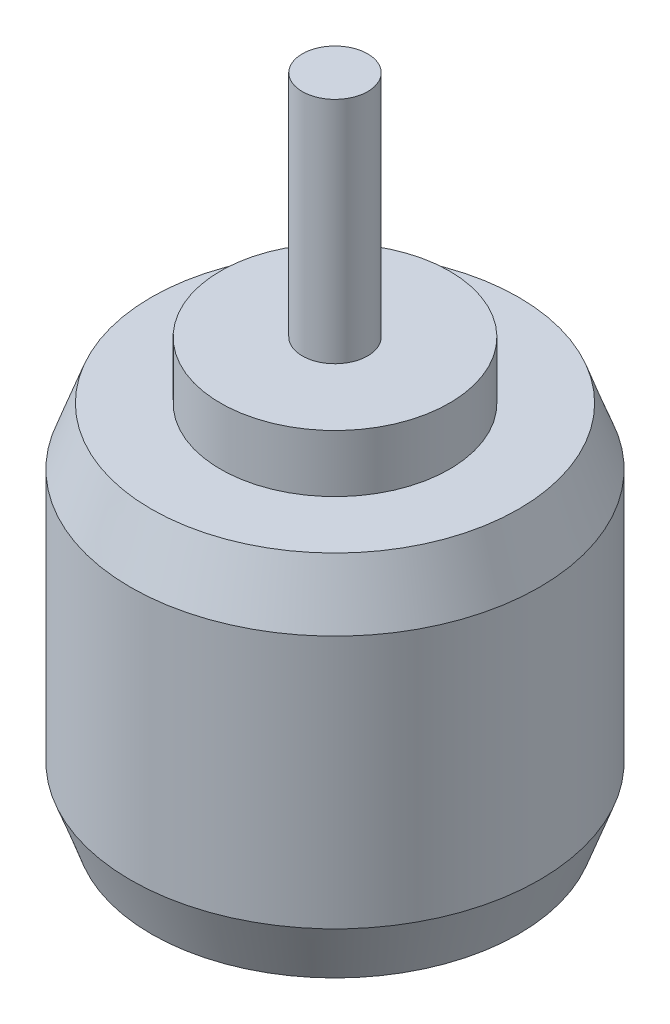
ISO-10303-21;
HEADER;
FILE_DESCRIPTION(('STEP AP214'),'2;1');
FILE_NAME('part.step','',(''),(''),'','','');
FILE_SCHEMA(('AUTOMOTIVE_DESIGN { 1 0 10303 214 1 1 1 1 }'));
ENDSEC;
DATA;
#1=APPLICATION_CONTEXT('core data for automotive mechanical design processes');
#2=APPLICATION_PROTOCOL_DEFINITION('international standard','automotive_design',2000,#1);
#3=PRODUCT_CONTEXT('',#1,'mechanical');
#4=PRODUCT('Part','Part','',(#3));
#5=PRODUCT_RELATED_PRODUCT_CATEGORY('part','',(#4));
#6=PRODUCT_DEFINITION_FORMATION('','',#4);
#7=PRODUCT_DEFINITION_CONTEXT('part definition',#1,'design');
#8=PRODUCT_DEFINITION('design','',#6,#7);
#9=PRODUCT_DEFINITION_SHAPE('','',#8);
#10=(LENGTH_UNIT() NAMED_UNIT(*) SI_UNIT(.MILLI.,.METRE.));
#11=(NAMED_UNIT(*) PLANE_ANGLE_UNIT() SI_UNIT($,.RADIAN.));
#12=(NAMED_UNIT(*) SI_UNIT($,.STERADIAN.) SOLID_ANGLE_UNIT());
#13=UNCERTAINTY_MEASURE_WITH_UNIT(LENGTH_MEASURE(1.E-05),#10,'distance_accuracy_value','');
#14=(GEOMETRIC_REPRESENTATION_CONTEXT(3) GLOBAL_UNCERTAINTY_ASSIGNED_CONTEXT((#13)) GLOBAL_UNIT_ASSIGNED_CONTEXT((#10,
#11,#12)) REPRESENTATION_CONTEXT('',''));
#15=CARTESIAN_POINT('',(0.,0.,0.));
#16=DIRECTION('',(0.,0.,1.));
#17=DIRECTION('',(1.,0.,0.));
#18=AXIS2_PLACEMENT_3D('',#15,#16,#17);
#19=CARTESIAN_POINT('',(0.,52.,0.));
#20=DIRECTION('',(0.,-1.,0.));
#21=DIRECTION('',(0.,0.,-1.));
#22=AXIS2_PLACEMENT_3D('',#19,#20,#21);
#23=PLANE('',#22);
#24=CARTESIAN_POINT('',(0.,52.,0.));
#25=DIRECTION('',(0.,-1.,0.));
#26=DIRECTION('',(0.,0.,-1.));
#27=AXIS2_PLACEMENT_3D('',#24,#25,#26);
#28=CIRCLE('',#27,14.);
#29=CARTESIAN_POINT('',(0.,52.,-14.));
#30=VERTEX_POINT('',#29);
#31=EDGE_CURVE('E83',#30,#30,#28,.T.);
#32=ORIENTED_EDGE('',*,*,#31,.F.);
#33=EDGE_LOOP('',(#32));
#34=FACE_BOUND('',#33,.T.);
#35=CARTESIAN_POINT('',(0.,52.,0.));
#36=DIRECTION('',(0.,-1.,0.));
#37=DIRECTION('',(0.,0.,-1.));
#38=AXIS2_PLACEMENT_3D('',#35,#36,#37);
#39=CIRCLE('',#38,4.);
#40=CARTESIAN_POINT('',(0.,52.,-4.));
#41=VERTEX_POINT('',#40);
#42=EDGE_CURVE('E68',#41,#41,#39,.T.);
#43=ORIENTED_EDGE('',*,*,#42,.T.);
#44=EDGE_LOOP('',(#43));
#45=FACE_BOUND('',#44,.T.);
#46=ADVANCED_FACE('F47',(#34,#45),#23,.F.);
#47=CARTESIAN_POINT('',(0.,45.,0.));
#48=DIRECTION('',(0.,-1.,0.));
#49=DIRECTION('',(0.,0.,-1.));
#50=AXIS2_PLACEMENT_3D('',#47,#48,#49);
#51=CYLINDRICAL_SURFACE('',#50,4.);
#52=CARTESIAN_POINT('',(0.,80.,0.));
#53=DIRECTION('',(0.,-1.,0.));
#54=DIRECTION('',(0.,0.,-1.));
#55=AXIS2_PLACEMENT_3D('',#52,#53,#54);
#56=CIRCLE('',#55,4.);
#57=CARTESIAN_POINT('',(0.,80.,-4.));
#58=VERTEX_POINT('',#57);
#59=EDGE_CURVE('E71',#58,#58,#56,.T.);
#60=ORIENTED_EDGE('',*,*,#59,.T.);
#61=EDGE_LOOP('',(#60));
#62=FACE_BOUND('',#61,.T.);
#63=ORIENTED_EDGE('',*,*,#42,.F.);
#64=EDGE_LOOP('',(#63));
#65=FACE_BOUND('',#64,.T.);
#66=ADVANCED_FACE('F149',(#62,#65),#51,.T.);
#67=CARTESIAN_POINT('',(0.,80.,0.));
#68=DIRECTION('',(0.,-1.,0.));
#69=DIRECTION('',(0.,0.,-1.));
#70=AXIS2_PLACEMENT_3D('',#67,#68,#69);
#71=PLANE('',#70);
#72=ORIENTED_EDGE('',*,*,#59,.F.);
#73=EDGE_LOOP('',(#72));
#74=FACE_BOUND('',#73,.T.);
#75=ADVANCED_FACE('F144',(#74),#71,.F.);
#76=CARTESIAN_POINT('',(0.,-2.,0.));
#77=DIRECTION('',(0.,-1.,0.));
#78=DIRECTION('',(0.,0.,-1.));
#79=AXIS2_PLACEMENT_3D('',#76,#77,#78);
#80=PLANE('',#79);
#81=CARTESIAN_POINT('',(0.,-2.,0.));
#82=DIRECTION('',(0.,-1.,0.));
#83=DIRECTION('',(0.,0.,-1.));
#84=AXIS2_PLACEMENT_3D('',#81,#82,#83);
#85=CIRCLE('',#84,3.);
#86=CARTESIAN_POINT('',(0.,-2.,-3.));
#87=VERTEX_POINT('',#86);
#88=EDGE_CURVE('E74',#87,#87,#85,.T.);
#89=ORIENTED_EDGE('',*,*,#88,.T.);
#90=EDGE_LOOP('',(#89));
#91=FACE_BOUND('',#90,.T.);
#92=ADVANCED_FACE('F137',(#91),#80,.T.);
#93=CARTESIAN_POINT('',(0.,45.,0.));
#94=DIRECTION('',(0.,-1.,0.));
#95=DIRECTION('',(0.,0.,-1.));
#96=AXIS2_PLACEMENT_3D('',#93,#94,#95);
#97=CYLINDRICAL_SURFACE('',#96,3.);
#98=ORIENTED_EDGE('',*,*,#88,.F.);
#99=EDGE_LOOP('',(#98));
#100=FACE_BOUND('',#99,.T.);
#101=CARTESIAN_POINT('',(0.,0.,0.));
#102=DIRECTION('',(0.,-1.,0.));
#103=DIRECTION('',(0.,0.,-1.));
#104=AXIS2_PLACEMENT_3D('',#101,#102,#103);
#105=CIRCLE('',#104,3.);
#106=CARTESIAN_POINT('',(0.,0.,-3.));
#107=VERTEX_POINT('',#106);
#108=EDGE_CURVE('E77',#107,#107,#105,.T.);
#109=ORIENTED_EDGE('',*,*,#108,.T.);
#110=EDGE_LOOP('',(#109));
#111=FACE_BOUND('',#110,.T.);
#112=ADVANCED_FACE('F124',(#100,#111),#97,.T.);
#113=CARTESIAN_POINT('',(0.,0.,0.));
#114=DIRECTION('',(0.,-1.,0.));
#115=DIRECTION('',(0.,0.,-1.));
#116=AXIS2_PLACEMENT_3D('',#113,#114,#115);
#117=PLANE('',#116);
#118=CARTESIAN_POINT('',(0.,0.,10.));
#119=DIRECTION('',(0.,-1.,0.));
#120=DIRECTION('',(1.,0.,0.));
#121=AXIS2_PLACEMENT_3D('',#118,#119,#120);
#122=CIRCLE('',#121,1.75);
#123=CARTESIAN_POINT('',(1.75,0.,10.));
#124=VERTEX_POINT('',#123);
#125=EDGE_CURVE('E105',#124,#124,#122,.T.);
#126=ORIENTED_EDGE('',*,*,#125,.F.);
#127=EDGE_LOOP('',(#126));
#128=FACE_BOUND('',#127,.T.);
#129=CARTESIAN_POINT('',(10.,0.,0.));
#130=DIRECTION('',(0.,-1.,0.));
#131=DIRECTION('',(1.,0.,0.));
#132=AXIS2_PLACEMENT_3D('',#129,#130,#131);
#133=CIRCLE('',#132,1.75);
#134=CARTESIAN_POINT('',(11.75,0.,0.));
#135=VERTEX_POINT('',#134);
#136=EDGE_CURVE('E102',#135,#135,#133,.T.);
#137=ORIENTED_EDGE('',*,*,#136,.F.);
#138=EDGE_LOOP('',(#137));
#139=FACE_BOUND('',#138,.T.);
#140=CARTESIAN_POINT('',(0.,0.,-10.));
#141=DIRECTION('',(0.,-1.,0.));
#142=DIRECTION('',(1.,0.,0.));
#143=AXIS2_PLACEMENT_3D('',#140,#141,#142);
#144=CIRCLE('',#143,1.75);
#145=CARTESIAN_POINT('',(1.74999999999993,0.,-10.));
#146=VERTEX_POINT('',#145);
#147=EDGE_CURVE('E96',#146,#146,#144,.T.);
#148=ORIENTED_EDGE('',*,*,#147,.F.);
#149=EDGE_LOOP('',(#148));
#150=FACE_BOUND('',#149,.T.);
#151=CARTESIAN_POINT('',(-10.,0.,1.04744440165294E-13));
#152=DIRECTION('',(0.,-1.,0.));
#153=DIRECTION('',(1.,0.,0.));
#154=AXIS2_PLACEMENT_3D('',#151,#152,#153);
#155=CIRCLE('',#154,1.75);
#156=CARTESIAN_POINT('',(-8.25,0.,1.04744440165294E-13));
#157=VERTEX_POINT('',#156);
#158=EDGE_CURVE('E90',#157,#157,#155,.T.);
#159=ORIENTED_EDGE('',*,*,#158,.F.);
#160=EDGE_LOOP('',(#159));
#161=FACE_BOUND('',#160,.T.);
#162=CARTESIAN_POINT('',(0.,0.,0.));
#163=DIRECTION('',(0.,-1.,0.));
#164=DIRECTION('',(0.,0.,-1.));
#165=AXIS2_PLACEMENT_3D('',#162,#163,#164);
#166=CIRCLE('',#165,22.4522083601366);
#167=CARTESIAN_POINT('',(0.,0.,-22.4522083601366));
#168=VERTEX_POINT('',#167);
#169=EDGE_CURVE('E63',#168,#168,#166,.T.);
#170=ORIENTED_EDGE('',*,*,#169,.T.);
#171=EDGE_LOOP('',(#170));
#172=FACE_BOUND('',#171,.T.);
#173=ORIENTED_EDGE('',*,*,#108,.F.);
#174=EDGE_LOOP('',(#173));
#175=FACE_BOUND('',#174,.T.);
#176=ADVANCED_FACE('F120',(#128,#139,#150,#161,#172,#175),#117,.T.);
#177=CARTESIAN_POINT('',(0.,45.,0.));
#178=DIRECTION('',(0.,-1.,0.));
#179=DIRECTION('',(0.,0.,-1.));
#180=AXIS2_PLACEMENT_3D('',#177,#178,#179);
#181=CYLINDRICAL_SURFACE('',#180,25.);
#182=CARTESIAN_POINT('',(0.,38.,0.));
#183=DIRECTION('',(0.,1.,0.));
#184=DIRECTION('',(0.,0.,1.));
#185=AXIS2_PLACEMENT_3D('',#182,#183,#184);
#186=CIRCLE('',#185,25.);
#187=CARTESIAN_POINT('',(0.,37.9999999999999,-25.));
#188=VERTEX_POINT('',#187);
#189=EDGE_CURVE('E55',#188,#188,#186,.F.);
#190=ORIENTED_EDGE('',*,*,#189,.T.);
#191=EDGE_LOOP('',(#190));
#192=FACE_BOUND('',#191,.T.);
#193=CARTESIAN_POINT('',(0.,7.00000000000009,0.));
#194=DIRECTION('',(0.,-1.,0.));
#195=DIRECTION('',(0.,0.,-1.));
#196=AXIS2_PLACEMENT_3D('',#193,#194,#195);
#197=CIRCLE('',#196,25.);
#198=CARTESIAN_POINT('',(0.,7.00000000000009,-25.));
#199=VERTEX_POINT('',#198);
#200=EDGE_CURVE('E59',#199,#199,#197,.F.);
#201=ORIENTED_EDGE('',*,*,#200,.T.);
#202=EDGE_LOOP('',(#201));
#203=FACE_BOUND('',#202,.T.);
#204=ADVANCED_FACE('F123',(#192,#203),#181,.T.);
#205=CARTESIAN_POINT('',(0.,45.,0.));
#206=DIRECTION('',(0.,1.,0.));
#207=DIRECTION('',(0.,0.,1.));
#208=AXIS2_PLACEMENT_3D('',#205,#206,#207);
#209=PLANE('',#208);
#210=CARTESIAN_POINT('',(0.,45.,0.));
#211=DIRECTION('',(0.,1.,0.));
#212=DIRECTION('',(0.,0.,1.));
#213=AXIS2_PLACEMENT_3D('',#210,#211,#212);
#214=CIRCLE('',#213,22.4522083601366);
#215=CARTESIAN_POINT('',(0.,45.,-22.4522083601366));
#216=VERTEX_POINT('',#215);
#217=EDGE_CURVE('E10',#216,#216,#214,.T.);
#218=ORIENTED_EDGE('',*,*,#217,.T.);
#219=EDGE_LOOP('',(#218));
#220=FACE_BOUND('',#219,.T.);
#221=CARTESIAN_POINT('',(0.,45.,0.));
#222=DIRECTION('',(0.,-1.,0.));
#223=DIRECTION('',(0.,0.,-1.));
#224=AXIS2_PLACEMENT_3D('',#221,#222,#223);
#225=CIRCLE('',#224,14.);
#226=CARTESIAN_POINT('',(0.,45.,-14.));
#227=VERTEX_POINT('',#226);
#228=EDGE_CURVE('E80',#227,#227,#225,.T.);
#229=ORIENTED_EDGE('',*,*,#228,.T.);
#230=EDGE_LOOP('',(#229));
#231=FACE_BOUND('',#230,.T.);
#232=ADVANCED_FACE('F172',(#220,#231),#209,.T.);
#233=CARTESIAN_POINT('',(0.,45.,0.));
#234=DIRECTION('',(0.,-1.,0.));
#235=DIRECTION('',(0.,0.,-1.));
#236=AXIS2_PLACEMENT_3D('',#233,#234,#235);
#237=CYLINDRICAL_SURFACE('',#236,14.);
#238=ORIENTED_EDGE('',*,*,#31,.T.);
#239=EDGE_LOOP('',(#238));
#240=FACE_BOUND('',#239,.T.);
#241=ORIENTED_EDGE('',*,*,#228,.F.);
#242=EDGE_LOOP('',(#241));
#243=FACE_BOUND('',#242,.T.);
#244=ADVANCED_FACE('F165',(#240,#243),#237,.T.);
#245=CARTESIAN_POINT('',(0.,0.,0.));
#246=DIRECTION('',(0.,1.,0.));
#247=DIRECTION('',(0.,0.,1.));
#248=AXIS2_PLACEMENT_3D('',#245,#246,#247);
#249=CONICAL_SURFACE('',#248,22.4522083601366,0.349065850398863);
#250=ORIENTED_EDGE('',*,*,#200,.F.);
#251=EDGE_LOOP('',(#250));
#252=FACE_BOUND('',#251,.T.);
#253=ORIENTED_EDGE('',*,*,#169,.F.);
#254=EDGE_LOOP('',(#253));
#255=FACE_BOUND('',#254,.T.);
#256=ADVANCED_FACE('F161',(#252,#255),#249,.T.);
#257=CARTESIAN_POINT('',(0.,38.,0.));
#258=DIRECTION('',(0.,-1.,0.));
#259=DIRECTION('',(0.,0.,-1.));
#260=AXIS2_PLACEMENT_3D('',#257,#258,#259);
#261=CONICAL_SURFACE('',#260,25.,0.349065850398863);
#262=CARTESIAN_POINT('',(0.,45.,-22.4522083601366));
#263=CARTESIAN_POINT('',(0.,44.9270833333333,-22.4787478563852));
#264=CARTESIAN_POINT('',(0.,44.8541666666667,-22.5052873526337));
#265=CARTESIAN_POINT('',(0.,44.7083333333333,-22.5583663451309));
#266=CARTESIAN_POINT('',(0.,44.6354166666667,-22.5849058413795));
#267=CARTESIAN_POINT('',(0.,44.4895833333333,-22.6379848338766));
#268=CARTESIAN_POINT('',(0.,44.4166666666667,-22.6645243301252));
#269=CARTESIAN_POINT('',(0.,44.2708333333333,-22.7176033226224));
#270=CARTESIAN_POINT('',(0.,44.1979166666667,-22.7441428188709));
#271=CARTESIAN_POINT('',(0.,44.0520833333333,-22.7972218113681));
#272=CARTESIAN_POINT('',(0.,43.9791666666667,-22.8237613076167));
#273=CARTESIAN_POINT('',(0.,43.8333333333333,-22.8768403001138));
#274=CARTESIAN_POINT('',(0.,43.7604166666667,-22.9033797963624));
#275=CARTESIAN_POINT('',(0.,43.6145833333333,-22.9564587888596));
#276=CARTESIAN_POINT('',(0.,43.5416666666667,-22.9829982851081));
#277=CARTESIAN_POINT('',(0.,43.3958333333333,-23.0360772776053));
#278=CARTESIAN_POINT('',(0.,43.3229166666667,-23.0626167738539));
#279=CARTESIAN_POINT('',(0.,43.1770833333333,-23.115695766351));
#280=CARTESIAN_POINT('',(0.,43.1041666666666,-23.1422352625996));
#281=CARTESIAN_POINT('',(0.,42.9583333333333,-23.1953142550968));
#282=CARTESIAN_POINT('',(0.,42.8854166666666,-23.2218537513453));
#283=CARTESIAN_POINT('',(0.,42.7395833333333,-23.2749327438425));
#284=CARTESIAN_POINT('',(0.,42.6666666666666,-23.3014722400911));
#285=CARTESIAN_POINT('',(0.,42.5208333333333,-23.3545512325882));
#286=CARTESIAN_POINT('',(0.,42.4479166666666,-23.3810907288368));
#287=CARTESIAN_POINT('',(0.,42.3020833333333,-23.4341697213339));
#288=CARTESIAN_POINT('',(0.,42.2291666666666,-23.4607092175825));
#289=CARTESIAN_POINT('',(0.,42.0833333333333,-23.5137882100797));
#290=CARTESIAN_POINT('',(0.,42.0104166666666,-23.5403277063283));
#291=CARTESIAN_POINT('',(0.,41.8645833333333,-23.5934066988254));
#292=CARTESIAN_POINT('',(0.,41.7916666666666,-23.619946195074));
#293=CARTESIAN_POINT('',(0.,41.6458333333333,-23.6730251875711));
#294=CARTESIAN_POINT('',(0.,41.5729166666666,-23.6995646838197));
#295=CARTESIAN_POINT('',(0.,41.4270833333333,-23.7526436763169));
#296=CARTESIAN_POINT('',(0.,41.3541666666666,-23.7791831725655));
#297=CARTESIAN_POINT('',(0.,41.2083333333333,-23.8322621650626));
#298=CARTESIAN_POINT('',(0.,41.1354166666666,-23.8588016613112));
#299=CARTESIAN_POINT('',(0.,40.9895833333333,-23.9118806538083));
#300=CARTESIAN_POINT('',(0.,40.9166666666666,-23.9384201500569));
#301=CARTESIAN_POINT('',(0.,40.7708333333333,-23.9914991425541));
#302=CARTESIAN_POINT('',(0.,40.6979166666666,-24.0180386388026));
#303=CARTESIAN_POINT('',(0.,40.5520833333333,-24.0711176312998));
#304=CARTESIAN_POINT('',(0.,40.4791666666666,-24.0976571275484));
#305=CARTESIAN_POINT('',(0.,40.3333333333333,-24.1507361200455));
#306=CARTESIAN_POINT('',(0.,40.2604166666666,-24.1772756162941));
#307=CARTESIAN_POINT('',(0.,40.1145833333333,-24.2303546087913));
#308=CARTESIAN_POINT('',(0.,40.0416666666666,-24.2568941050398));
#309=CARTESIAN_POINT('',(0.,39.8958333333333,-24.309973097537));
#310=CARTESIAN_POINT('',(0.,39.8229166666666,-24.3365125937856));
#311=CARTESIAN_POINT('',(0.,39.6770833333333,-24.3895915862827));
#312=CARTESIAN_POINT('',(0.,39.6041666666666,-24.4161310825313));
#313=CARTESIAN_POINT('',(0.,39.4583333333333,-24.4692100750285));
#314=CARTESIAN_POINT('',(0.,39.3854166666666,-24.495749571277));
#315=CARTESIAN_POINT('',(0.,39.2395833333333,-24.5488285637742));
#316=CARTESIAN_POINT('',(0.,39.1666666666666,-24.5753680600228));
#317=CARTESIAN_POINT('',(0.,39.0208333333333,-24.6284470525199));
#318=CARTESIAN_POINT('',(0.,38.9479166666666,-24.6549865487685));
#319=CARTESIAN_POINT('',(0.,38.8020833333333,-24.7080655412657));
#320=CARTESIAN_POINT('',(0.,38.7291666666666,-24.7346050375142));
#321=CARTESIAN_POINT('',(0.,38.5833333333333,-24.7876840300114));
#322=CARTESIAN_POINT('',(0.,38.5104166666666,-24.81422352626));
#323=CARTESIAN_POINT('',(0.,38.3645833333333,-24.8673025187571));
#324=CARTESIAN_POINT('',(0.,38.2916666666666,-24.8938420150057));
#325=CARTESIAN_POINT('',(0.,38.1458333333333,-24.9469210075028));
#326=CARTESIAN_POINT('',(0.,38.0729166666666,-24.9734605037514));
#327=CARTESIAN_POINT('',(0.,38.,-25.));
#328=B_SPLINE_CURVE_WITH_KNOTS('',3,(#262,#263,#264,#265,#266,#267,#268,#269,#270,#271,#272,
#273,#274,#275,#276,#277,#278,#279,#280,#281,#282,#283,#284,#285,#286,#287,#288,#289,#290,#291,
#292,#293,#294,#295,#296,#297,#298,#299,#300,#301,#302,#303,#304,#305,#306,#307,#308,#309,#310,
#311,#312,#313,#314,#315,#316,#317,#318,#319,#320,#321,#322,#323,#324,#325,#326,#327),
.UNSPECIFIED.,.F.,.F.,(4,2,2,2,2,2,2,2,2,2,2,2,2,2,2,2,2,2,2,2,2,2,2,2,2,2,2,2,2,2,2,2,4),(0.,
0.232788887729103,0.465577775458213,0.698366663187321,0.931155550916425,1.16394443864553,
1.39673332637464,1.62952221410374,1.86231110183285,2.09509998956196,2.32788887729107,
2.56067776502018,2.79346665274928,3.02625554047839,3.2590444282075,3.49183331593661,
3.72462220366572,3.95741109139482,4.19019997912393,4.42298886685304,4.65577775458214,
4.88856664231125,5.12135553004036,5.35414441776946,5.58693330549857,5.81972219322768,
6.05251108095678,6.28529996868589,6.518088856415,6.75087774414411,6.98366663187321,
7.21645551960232,7.44924440733142),.UNSPECIFIED.);
#329=EDGE_CURVE('BSEAM50',#216,#188,#328,.T.);
#330=ORIENTED_EDGE('',*,*,#217,.F.);
#331=ORIENTED_EDGE('',*,*,#189,.F.);
#332=ORIENTED_EDGE('',*,*,#329,.T.);
#333=ORIENTED_EDGE('',*,*,#329,.F.);
#334=EDGE_LOOP('',(#330,#332,#331,#333));
#335=FACE_BOUND('',#334,.T.);
#336=ADVANCED_FACE('F50',(#335),#261,.T.);
#337=CARTESIAN_POINT('',(-10.,10.,1.04744440165294E-13));
#338=DIRECTION('',(0.,-1.,0.));
#339=DIRECTION('',(1.,0.,0.));
#340=AXIS2_PLACEMENT_3D('',#337,#338,#339);
#341=CYLINDRICAL_SURFACE('',#340,1.75);
#342=CARTESIAN_POINT('',(-10.,10.,1.04744440165294E-13));
#343=DIRECTION('',(0.,-1.,0.));
#344=DIRECTION('',(1.,0.,0.));
#345=AXIS2_PLACEMENT_3D('',#342,#343,#344);
#346=CIRCLE('',#345,1.75);
#347=CARTESIAN_POINT('',(-8.25,10.,1.04744440165294E-13));
#348=VERTEX_POINT('',#347);
#349=EDGE_CURVE('E87',#348,#348,#346,.T.);
#350=ORIENTED_EDGE('',*,*,#349,.F.);
#351=EDGE_LOOP('',(#350));
#352=FACE_BOUND('',#351,.T.);
#353=ORIENTED_EDGE('',*,*,#158,.T.);
#354=EDGE_LOOP('',(#353));
#355=FACE_BOUND('',#354,.T.);
#356=ADVANCED_FACE('F170',(#352,#355),#341,.F.);
#357=CARTESIAN_POINT('',(-10.,10.,1.04744440165294E-13));
#358=DIRECTION('',(0.,-1.,0.));
#359=DIRECTION('',(1.,0.,0.));
#360=AXIS2_PLACEMENT_3D('',#357,#358,#359);
#361=PLANE('',#360);
#362=ORIENTED_EDGE('',*,*,#349,.T.);
#363=EDGE_LOOP('',(#362));
#364=FACE_BOUND('',#363,.T.);
#365=ADVANCED_FACE('F186',(#364),#361,.T.);
#366=CARTESIAN_POINT('',(0.,10.,-10.));
#367=DIRECTION('',(0.,-1.,0.));
#368=DIRECTION('',(1.,0.,0.));
#369=AXIS2_PLACEMENT_3D('',#366,#367,#368);
#370=CYLINDRICAL_SURFACE('',#369,1.75);
#371=CARTESIAN_POINT('',(0.,10.,-10.));
#372=DIRECTION('',(0.,-1.,0.));
#373=DIRECTION('',(1.,0.,0.));
#374=AXIS2_PLACEMENT_3D('',#371,#372,#373);
#375=CIRCLE('',#374,1.75);
#376=CARTESIAN_POINT('',(1.74999999999993,10.,-10.));
#377=VERTEX_POINT('',#376);
#378=EDGE_CURVE('E93',#377,#377,#375,.T.);
#379=ORIENTED_EDGE('',*,*,#378,.F.);
#380=EDGE_LOOP('',(#379));
#381=FACE_BOUND('',#380,.T.);
#382=ORIENTED_EDGE('',*,*,#147,.T.);
#383=EDGE_LOOP('',(#382));
#384=FACE_BOUND('',#383,.T.);
#385=ADVANCED_FACE('F189',(#381,#384),#370,.F.);
#386=CARTESIAN_POINT('',(0.,10.,-10.));
#387=DIRECTION('',(0.,-1.,0.));
#388=DIRECTION('',(1.,0.,0.));
#389=AXIS2_PLACEMENT_3D('',#386,#387,#388);
#390=PLANE('',#389);
#391=ORIENTED_EDGE('',*,*,#378,.T.);
#392=EDGE_LOOP('',(#391));
#393=FACE_BOUND('',#392,.T.);
#394=ADVANCED_FACE('F194',(#393),#390,.T.);
#395=CARTESIAN_POINT('',(10.,10.,0.));
#396=DIRECTION('',(0.,-1.,0.));
#397=DIRECTION('',(1.,0.,0.));
#398=AXIS2_PLACEMENT_3D('',#395,#396,#397);
#399=CYLINDRICAL_SURFACE('',#398,1.75);
#400=CARTESIAN_POINT('',(10.,10.,0.));
#401=DIRECTION('',(0.,-1.,0.));
#402=DIRECTION('',(1.,0.,0.));
#403=AXIS2_PLACEMENT_3D('',#400,#401,#402);
#404=CIRCLE('',#403,1.75);
#405=CARTESIAN_POINT('',(11.75,10.,0.));
#406=VERTEX_POINT('',#405);
#407=EDGE_CURVE('E99',#406,#406,#404,.T.);
#408=ORIENTED_EDGE('',*,*,#407,.F.);
#409=EDGE_LOOP('',(#408));
#410=FACE_BOUND('',#409,.T.);
#411=ORIENTED_EDGE('',*,*,#136,.T.);
#412=EDGE_LOOP('',(#411));
#413=FACE_BOUND('',#412,.T.);
#414=ADVANCED_FACE('F197',(#410,#413),#399,.F.);
#415=CARTESIAN_POINT('',(10.,10.,0.));
#416=DIRECTION('',(0.,-1.,0.));
#417=DIRECTION('',(1.,0.,0.));
#418=AXIS2_PLACEMENT_3D('',#415,#416,#417);
#419=PLANE('',#418);
#420=ORIENTED_EDGE('',*,*,#407,.T.);
#421=EDGE_LOOP('',(#420));
#422=FACE_BOUND('',#421,.T.);
#423=ADVANCED_FACE('F116',(#422),#419,.T.);
#424=CARTESIAN_POINT('',(0.,10.,10.));
#425=DIRECTION('',(0.,-1.,0.));
#426=DIRECTION('',(1.,0.,0.));
#427=AXIS2_PLACEMENT_3D('',#424,#425,#426);
#428=CYLINDRICAL_SURFACE('',#427,1.75);
#429=CARTESIAN_POINT('',(0.,10.,10.));
#430=DIRECTION('',(0.,-1.,0.));
#431=DIRECTION('',(1.,0.,0.));
#432=AXIS2_PLACEMENT_3D('',#429,#430,#431);
#433=CIRCLE('',#432,1.75);
#434=CARTESIAN_POINT('',(1.75,10.,10.));
#435=VERTEX_POINT('',#434);
#436=EDGE_CURVE('E86',#435,#435,#433,.T.);
#437=ORIENTED_EDGE('',*,*,#436,.F.);
#438=EDGE_LOOP('',(#437));
#439=FACE_BOUND('',#438,.T.);
#440=ORIENTED_EDGE('',*,*,#125,.T.);
#441=EDGE_LOOP('',(#440));
#442=FACE_BOUND('',#441,.T.);
#443=ADVANCED_FACE('F113',(#439,#442),#428,.F.);
#444=CARTESIAN_POINT('',(0.,10.,10.));
#445=DIRECTION('',(0.,-1.,0.));
#446=DIRECTION('',(1.,0.,0.));
#447=AXIS2_PLACEMENT_3D('',#444,#445,#446);
#448=PLANE('',#447);
#449=ORIENTED_EDGE('',*,*,#436,.T.);
#450=EDGE_LOOP('',(#449));
#451=FACE_BOUND('',#450,.T.);
#452=ADVANCED_FACE('F111',(#451),#448,.T.);
#453=CLOSED_SHELL('',(#46,#66,#75,#92,#112,#176,#204,#232,#244,#256,#336,#356,#365,#385,#394,
#414,#423,#443,#452));
#454=MANIFOLD_SOLID_BREP('B2',#453);
#455=ADVANCED_BREP_SHAPE_REPRESENTATION('',(#18,#454),#14);
#456=SHAPE_DEFINITION_REPRESENTATION(#9,#455);
ENDSEC;
END-ISO-10303-21;
